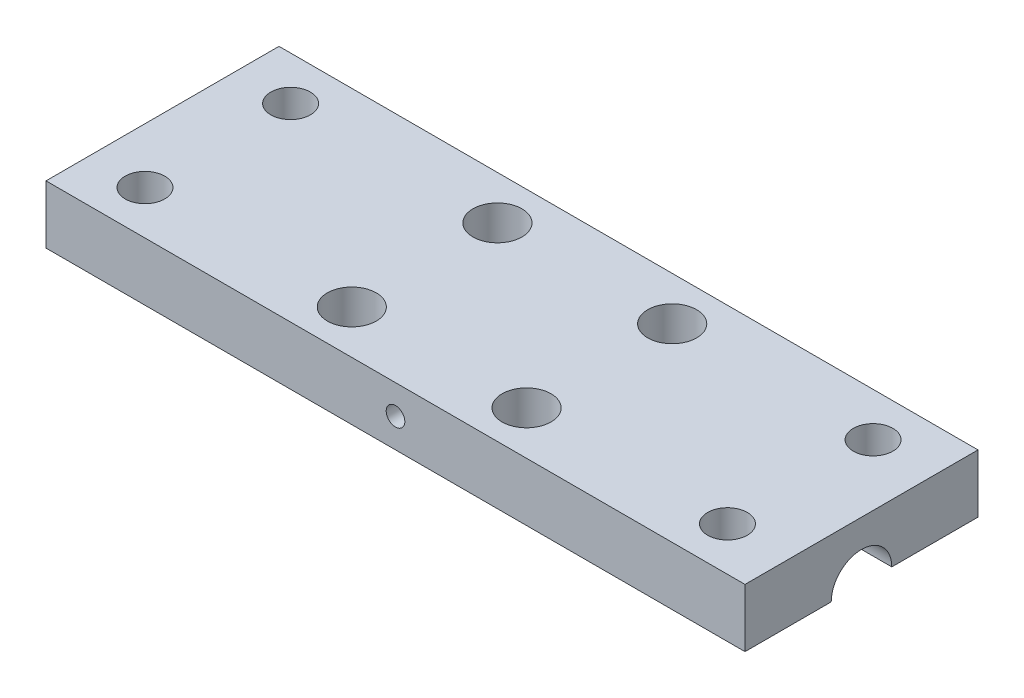
ISO-10303-21;
HEADER;
FILE_DESCRIPTION(('STEP AP214'),'2;1');
FILE_NAME('part.step','',(''),(''),'','','');
FILE_SCHEMA(('AUTOMOTIVE_DESIGN { 1 0 10303 214 1 1 1 1 }'));
ENDSEC;
DATA;
#1=APPLICATION_CONTEXT('core data for automotive mechanical design processes');
#2=APPLICATION_PROTOCOL_DEFINITION('international standard','automotive_design',2000,#1);
#3=PRODUCT_CONTEXT('',#1,'mechanical');
#4=PRODUCT('Part','Part','',(#3));
#5=PRODUCT_RELATED_PRODUCT_CATEGORY('part','',(#4));
#6=PRODUCT_DEFINITION_FORMATION('','',#4);
#7=PRODUCT_DEFINITION_CONTEXT('part definition',#1,'design');
#8=PRODUCT_DEFINITION('design','',#6,#7);
#9=PRODUCT_DEFINITION_SHAPE('','',#8);
#10=(LENGTH_UNIT() NAMED_UNIT(*) SI_UNIT(.MILLI.,.METRE.));
#11=(NAMED_UNIT(*) PLANE_ANGLE_UNIT() SI_UNIT($,.RADIAN.));
#12=(NAMED_UNIT(*) SI_UNIT($,.STERADIAN.) SOLID_ANGLE_UNIT());
#13=UNCERTAINTY_MEASURE_WITH_UNIT(LENGTH_MEASURE(1.E-05),#10,'distance_accuracy_value','');
#14=(GEOMETRIC_REPRESENTATION_CONTEXT(3) GLOBAL_UNCERTAINTY_ASSIGNED_CONTEXT((#13)) GLOBAL_UNIT_ASSIGNED_CONTEXT((#10,
#11,#12)) REPRESENTATION_CONTEXT('',''));
#15=CARTESIAN_POINT('',(0.,0.,0.));
#16=DIRECTION('',(0.,0.,1.));
#17=DIRECTION('',(1.,0.,0.));
#18=AXIS2_PLACEMENT_3D('',#15,#16,#17);
#19=CARTESIAN_POINT('',(0.,0.,0.));
#20=DIRECTION('',(0.,1.,0.));
#21=DIRECTION('',(0.,0.,1.));
#22=AXIS2_PLACEMENT_3D('',#19,#20,#21);
#23=PLANE('',#22);
#24=CARTESIAN_POINT('',(-32.0740758823868,0.,7.9375));
#25=DIRECTION('',(0.,1.,0.));
#26=DIRECTION('',(0.,0.,1.));
#27=AXIS2_PLACEMENT_3D('',#24,#25,#26);
#28=CIRCLE('',#27,2.159);
#29=CARTESIAN_POINT('',(-32.0740758823868,0.,10.0965));
#30=VERTEX_POINT('',#29);
#31=EDGE_CURVE('E176',#30,#30,#28,.T.);
#32=ORIENTED_EDGE('',*,*,#31,.T.);
#33=EDGE_LOOP('',(#32));
#34=FACE_BOUND('',#33,.T.);
#35=CARTESIAN_POINT('',(31.4259241176133,0.,7.9375));
#36=DIRECTION('',(0.,1.,0.));
#37=DIRECTION('',(0.,0.,1.));
#38=AXIS2_PLACEMENT_3D('',#35,#36,#37);
#39=CIRCLE('',#38,2.159);
#40=CARTESIAN_POINT('',(31.4259241176133,0.,10.0965));
#41=VERTEX_POINT('',#40);
#42=EDGE_CURVE('E233',#41,#41,#39,.T.);
#43=ORIENTED_EDGE('',*,*,#42,.T.);
#44=EDGE_LOOP('',(#43));
#45=FACE_BOUND('',#44,.T.);
#46=CARTESIAN_POINT('',(-9.525,0.,7.9375));
#47=DIRECTION('',(0.,1.,0.));
#48=DIRECTION('',(0.,0.,1.));
#49=AXIS2_PLACEMENT_3D('',#46,#47,#48);
#50=CIRCLE('',#49,2.667);
#51=CARTESIAN_POINT('',(-9.525,0.,10.6045));
#52=VERTEX_POINT('',#51);
#53=EDGE_CURVE('E223',#52,#52,#50,.T.);
#54=ORIENTED_EDGE('',*,*,#53,.T.);
#55=EDGE_LOOP('',(#54));
#56=FACE_BOUND('',#55,.T.);
#57=CARTESIAN_POINT('',(9.525,0.,7.9375));
#58=DIRECTION('',(0.,1.,0.));
#59=DIRECTION('',(0.,0.,1.));
#60=AXIS2_PLACEMENT_3D('',#57,#58,#59);
#61=CIRCLE('',#60,2.667);
#62=CARTESIAN_POINT('',(9.525,0.,10.6045));
#63=VERTEX_POINT('',#62);
#64=EDGE_CURVE('E213',#63,#63,#61,.T.);
#65=ORIENTED_EDGE('',*,*,#64,.T.);
#66=EDGE_LOOP('',(#65));
#67=FACE_BOUND('',#66,.T.);
#68=DIRECTION('',(0.,0.,1.));
#69=VECTOR('',#68,1.);
#70=CARTESIAN_POINT('',(-38.1,0.,-12.7));
#71=LINE('',#70,#69);
#72=CARTESIAN_POINT('',(-38.1,0.,3.30199999999999));
#73=VERTEX_POINT('',#72);
#74=CARTESIAN_POINT('',(-38.1,0.,12.7));
#75=VERTEX_POINT('',#74);
#76=EDGE_CURVE('E133',#73,#75,#71,.T.);
#77=ORIENTED_EDGE('',*,*,#76,.F.);
#78=DIRECTION('',(1.,0.,0.));
#79=VECTOR('',#78,1.);
#80=CARTESIAN_POINT('',(-38.1,0.,3.30199999999999));
#81=LINE('',#80,#79);
#82=CARTESIAN_POINT('',(38.1,0.,3.30200000000001));
#83=VERTEX_POINT('',#82);
#84=EDGE_CURVE('E11',#73,#83,#81,.T.);
#85=ORIENTED_EDGE('',*,*,#84,.T.);
#86=DIRECTION('',(0.,0.,-1.));
#87=VECTOR('',#86,1.);
#88=CARTESIAN_POINT('',(38.1,0.,-12.7));
#89=LINE('',#88,#87);
#90=CARTESIAN_POINT('',(38.1,0.,12.7));
#91=VERTEX_POINT('',#90);
#92=EDGE_CURVE('E110',#91,#83,#89,.T.);
#93=ORIENTED_EDGE('',*,*,#92,.F.);
#94=DIRECTION('',(1.,0.,0.));
#95=VECTOR('',#94,1.);
#96=CARTESIAN_POINT('',(-38.1,0.,12.7));
#97=LINE('',#96,#95);
#98=EDGE_CURVE('E113',#75,#91,#97,.T.);
#99=ORIENTED_EDGE('',*,*,#98,.F.);
#100=EDGE_LOOP('',(#77,#85,#93,#99));
#101=FACE_BOUND('',#100,.T.);
#102=ADVANCED_FACE('F35',(#34,#45,#56,#67,#101),#23,.F.);
#103=CARTESIAN_POINT('',(-38.1,6.35,-12.7));
#104=DIRECTION('',(1.,0.,0.));
#105=DIRECTION('',(0.,0.,-1.));
#106=AXIS2_PLACEMENT_3D('',#103,#104,#105);
#107=PLANE('',#106);
#108=CARTESIAN_POINT('',(-38.1,0.,-12.7));
#109=VERTEX_POINT('',#108);
#110=CARTESIAN_POINT('',(-38.1,0.,-3.30200000000001));
#111=VERTEX_POINT('',#110);
#112=EDGE_CURVE('E115',#109,#111,#71,.T.);
#113=ORIENTED_EDGE('',*,*,#112,.T.);
#114=CARTESIAN_POINT('',(-38.1,0.,0.));
#115=DIRECTION('',(1.,0.,0.));
#116=DIRECTION('',(0.,0.,-1.));
#117=AXIS2_PLACEMENT_3D('',#114,#115,#116);
#118=CIRCLE('',#117,3.302);
#119=EDGE_CURVE('E50',#111,#73,#118,.T.);
#120=ORIENTED_EDGE('',*,*,#119,.T.);
#121=ORIENTED_EDGE('',*,*,#76,.T.);
#122=DIRECTION('',(0.,-1.,0.));
#123=VECTOR('',#122,1.);
#124=CARTESIAN_POINT('',(-38.1,6.35,12.7));
#125=LINE('',#124,#123);
#126=CARTESIAN_POINT('',(-38.1,6.35,12.7));
#127=VERTEX_POINT('',#126);
#128=EDGE_CURVE('E102',#127,#75,#125,.T.);
#129=ORIENTED_EDGE('',*,*,#128,.F.);
#130=DIRECTION('',(0.,0.,1.));
#131=VECTOR('',#130,1.);
#132=CARTESIAN_POINT('',(-38.1,6.35,-12.7));
#133=LINE('',#132,#131);
#134=CARTESIAN_POINT('',(-38.1,6.35,-12.7));
#135=VERTEX_POINT('',#134);
#136=EDGE_CURVE('E120',#135,#127,#133,.T.);
#137=ORIENTED_EDGE('',*,*,#136,.F.);
#138=DIRECTION('',(0.,-1.,0.));
#139=VECTOR('',#138,1.);
#140=CARTESIAN_POINT('',(-38.1,6.35,-12.7));
#141=LINE('',#140,#139);
#142=EDGE_CURVE('E121',#135,#109,#141,.T.);
#143=ORIENTED_EDGE('',*,*,#142,.T.);
#144=EDGE_LOOP('',(#113,#120,#121,#129,#137,#143));
#145=FACE_BOUND('',#144,.T.);
#146=ADVANCED_FACE('F37',(#145),#107,.F.);
#147=CARTESIAN_POINT('',(-38.1,6.35,12.7));
#148=DIRECTION('',(0.,0.,-1.));
#149=DIRECTION('',(-1.,0.,0.));
#150=AXIS2_PLACEMENT_3D('',#147,#148,#149);
#151=PLANE('',#150);
#152=CARTESIAN_POINT('',(0.,3.175,12.7));
#153=DIRECTION('',(0.,0.,1.));
#154=DIRECTION('',(1.,0.,0.));
#155=AXIS2_PLACEMENT_3D('',#152,#153,#154);
#156=CIRCLE('',#155,1.016);
#157=CARTESIAN_POINT('',(1.016,3.175,12.7));
#158=VERTEX_POINT('',#157);
#159=EDGE_CURVE('E200',#158,#158,#156,.T.);
#160=ORIENTED_EDGE('',*,*,#159,.F.);
#161=EDGE_LOOP('',(#160));
#162=FACE_BOUND('',#161,.T.);
#163=ORIENTED_EDGE('',*,*,#98,.T.);
#164=DIRECTION('',(0.,-1.,0.));
#165=VECTOR('',#164,1.);
#166=CARTESIAN_POINT('',(38.1,6.35,12.7));
#167=LINE('',#166,#165);
#168=CARTESIAN_POINT('',(38.1,6.35,12.7));
#169=VERTEX_POINT('',#168);
#170=EDGE_CURVE('E125',#169,#91,#167,.T.);
#171=ORIENTED_EDGE('',*,*,#170,.F.);
#172=DIRECTION('',(1.,0.,0.));
#173=VECTOR('',#172,1.);
#174=CARTESIAN_POINT('',(-38.1,6.35,12.7));
#175=LINE('',#174,#173);
#176=EDGE_CURVE('E88',#127,#169,#175,.T.);
#177=ORIENTED_EDGE('',*,*,#176,.F.);
#178=ORIENTED_EDGE('',*,*,#128,.T.);
#179=EDGE_LOOP('',(#163,#171,#177,#178));
#180=FACE_BOUND('',#179,.T.);
#181=ADVANCED_FACE('F128',(#162,#180),#151,.F.);
#182=CARTESIAN_POINT('',(38.1,6.35,-12.7));
#183=DIRECTION('',(-1.,0.,0.));
#184=DIRECTION('',(0.,0.,1.));
#185=AXIS2_PLACEMENT_3D('',#182,#183,#184);
#186=PLANE('',#185);
#187=ORIENTED_EDGE('',*,*,#92,.T.);
#188=CARTESIAN_POINT('',(38.1,0.,0.));
#189=DIRECTION('',(1.,0.,0.));
#190=DIRECTION('',(0.,0.,-1.));
#191=AXIS2_PLACEMENT_3D('',#188,#189,#190);
#192=CIRCLE('',#191,3.302);
#193=CARTESIAN_POINT('',(38.1,0.,-3.30199999999999));
#194=VERTEX_POINT('',#193);
#195=EDGE_CURVE('E97',#194,#83,#192,.T.);
#196=ORIENTED_EDGE('',*,*,#195,.F.);
#197=CARTESIAN_POINT('',(38.1,0.,-12.7));
#198=VERTEX_POINT('',#197);
#199=EDGE_CURVE('E107',#194,#198,#89,.T.);
#200=ORIENTED_EDGE('',*,*,#199,.T.);
#201=DIRECTION('',(0.,-1.,0.));
#202=VECTOR('',#201,1.);
#203=CARTESIAN_POINT('',(38.1,6.35,-12.7));
#204=LINE('',#203,#202);
#205=CARTESIAN_POINT('',(38.1,6.35,-12.7));
#206=VERTEX_POINT('',#205);
#207=EDGE_CURVE('E123',#206,#198,#204,.T.);
#208=ORIENTED_EDGE('',*,*,#207,.F.);
#209=DIRECTION('',(0.,0.,-1.));
#210=VECTOR('',#209,1.);
#211=CARTESIAN_POINT('',(38.1,6.35,-12.7));
#212=LINE('',#211,#210);
#213=EDGE_CURVE('E184',#169,#206,#212,.T.);
#214=ORIENTED_EDGE('',*,*,#213,.F.);
#215=ORIENTED_EDGE('',*,*,#170,.T.);
#216=EDGE_LOOP('',(#187,#196,#200,#208,#214,#215));
#217=FACE_BOUND('',#216,.T.);
#218=ADVANCED_FACE('F105',(#217),#186,.F.);
#219=CARTESIAN_POINT('',(-38.1,6.35,-12.7));
#220=DIRECTION('',(0.,0.,1.));
#221=DIRECTION('',(1.,0.,0.));
#222=AXIS2_PLACEMENT_3D('',#219,#220,#221);
#223=PLANE('',#222);
#224=CARTESIAN_POINT('',(0.,3.175,-12.7));
#225=DIRECTION('',(0.,0.,-1.));
#226=DIRECTION('',(-1.,0.,0.));
#227=AXIS2_PLACEMENT_3D('',#224,#225,#226);
#228=CIRCLE('',#227,1.016);
#229=CARTESIAN_POINT('',(-1.016,3.175,-12.7));
#230=VERTEX_POINT('',#229);
#231=EDGE_CURVE('E209',#230,#230,#228,.T.);
#232=ORIENTED_EDGE('',*,*,#231,.F.);
#233=EDGE_LOOP('',(#232));
#234=FACE_BOUND('',#233,.T.);
#235=DIRECTION('',(-1.,0.,0.));
#236=VECTOR('',#235,1.);
#237=CARTESIAN_POINT('',(-38.1,0.,-12.7));
#238=LINE('',#237,#236);
#239=EDGE_CURVE('E80',#198,#109,#238,.T.);
#240=ORIENTED_EDGE('',*,*,#239,.T.);
#241=ORIENTED_EDGE('',*,*,#142,.F.);
#242=DIRECTION('',(-1.,0.,0.));
#243=VECTOR('',#242,1.);
#244=CARTESIAN_POINT('',(-38.1,6.35,-12.7));
#245=LINE('',#244,#243);
#246=EDGE_CURVE('E59',#206,#135,#245,.T.);
#247=ORIENTED_EDGE('',*,*,#246,.F.);
#248=ORIENTED_EDGE('',*,*,#207,.T.);
#249=EDGE_LOOP('',(#240,#241,#247,#248));
#250=FACE_BOUND('',#249,.T.);
#251=ADVANCED_FACE('F157',(#234,#250),#223,.F.);
#252=CARTESIAN_POINT('',(0.,6.35,0.));
#253=DIRECTION('',(0.,1.,0.));
#254=DIRECTION('',(0.,0.,1.));
#255=AXIS2_PLACEMENT_3D('',#252,#253,#254);
#256=PLANE('',#255);
#257=CARTESIAN_POINT('',(9.525,6.35,7.9375));
#258=DIRECTION('',(0.,1.,0.));
#259=DIRECTION('',(0.,0.,1.));
#260=AXIS2_PLACEMENT_3D('',#257,#258,#259);
#261=CIRCLE('',#260,2.667);
#262=CARTESIAN_POINT('',(9.525,6.35,10.6045));
#263=VERTEX_POINT('',#262);
#264=EDGE_CURVE('E206',#263,#263,#261,.T.);
#265=ORIENTED_EDGE('',*,*,#264,.F.);
#266=EDGE_LOOP('',(#265));
#267=FACE_BOUND('',#266,.T.);
#268=CARTESIAN_POINT('',(9.525,6.35,-7.9375));
#269=DIRECTION('',(0.,1.,0.));
#270=DIRECTION('',(0.,0.,1.));
#271=AXIS2_PLACEMENT_3D('',#268,#269,#270);
#272=CIRCLE('',#271,2.667);
#273=CARTESIAN_POINT('',(9.525,6.35,-5.2705));
#274=VERTEX_POINT('',#273);
#275=EDGE_CURVE('E216',#274,#274,#272,.T.);
#276=ORIENTED_EDGE('',*,*,#275,.F.);
#277=EDGE_LOOP('',(#276));
#278=FACE_BOUND('',#277,.T.);
#279=CARTESIAN_POINT('',(-9.525,6.35,7.9375));
#280=DIRECTION('',(0.,1.,0.));
#281=DIRECTION('',(0.,0.,1.));
#282=AXIS2_PLACEMENT_3D('',#279,#280,#281);
#283=CIRCLE('',#282,2.667);
#284=CARTESIAN_POINT('',(-9.525,6.35,10.6045));
#285=VERTEX_POINT('',#284);
#286=EDGE_CURVE('E220',#285,#285,#283,.T.);
#287=ORIENTED_EDGE('',*,*,#286,.F.);
#288=EDGE_LOOP('',(#287));
#289=FACE_BOUND('',#288,.T.);
#290=CARTESIAN_POINT('',(-9.525,6.35,-7.9375));
#291=DIRECTION('',(0.,1.,0.));
#292=DIRECTION('',(0.,0.,1.));
#293=AXIS2_PLACEMENT_3D('',#290,#291,#292);
#294=CIRCLE('',#293,2.667);
#295=CARTESIAN_POINT('',(-9.525,6.35,-5.2705));
#296=VERTEX_POINT('',#295);
#297=EDGE_CURVE('E226',#296,#296,#294,.T.);
#298=ORIENTED_EDGE('',*,*,#297,.F.);
#299=EDGE_LOOP('',(#298));
#300=FACE_BOUND('',#299,.T.);
#301=CARTESIAN_POINT('',(31.4259241176133,6.35,7.9375));
#302=DIRECTION('',(0.,1.,0.));
#303=DIRECTION('',(0.,0.,1.));
#304=AXIS2_PLACEMENT_3D('',#301,#302,#303);
#305=CIRCLE('',#304,2.159);
#306=CARTESIAN_POINT('',(31.4259241176133,6.35,10.0965));
#307=VERTEX_POINT('',#306);
#308=EDGE_CURVE('E230',#307,#307,#305,.T.);
#309=ORIENTED_EDGE('',*,*,#308,.F.);
#310=EDGE_LOOP('',(#309));
#311=FACE_BOUND('',#310,.T.);
#312=CARTESIAN_POINT('',(31.4259241176133,6.35,-7.9375));
#313=DIRECTION('',(0.,1.,0.));
#314=DIRECTION('',(0.,0.,1.));
#315=AXIS2_PLACEMENT_3D('',#312,#313,#314);
#316=CIRCLE('',#315,2.159);
#317=CARTESIAN_POINT('',(31.4259241176133,6.35,-5.7785));
#318=VERTEX_POINT('',#317);
#319=EDGE_CURVE('E236',#318,#318,#316,.T.);
#320=ORIENTED_EDGE('',*,*,#319,.F.);
#321=EDGE_LOOP('',(#320));
#322=FACE_BOUND('',#321,.T.);
#323=CARTESIAN_POINT('',(-32.0740758823868,6.35,7.9375));
#324=DIRECTION('',(0.,1.,0.));
#325=DIRECTION('',(0.,0.,1.));
#326=AXIS2_PLACEMENT_3D('',#323,#324,#325);
#327=CIRCLE('',#326,2.159);
#328=CARTESIAN_POINT('',(-32.0740758823868,6.35,10.0965));
#329=VERTEX_POINT('',#328);
#330=EDGE_CURVE('E179',#329,#329,#327,.T.);
#331=ORIENTED_EDGE('',*,*,#330,.F.);
#332=EDGE_LOOP('',(#331));
#333=FACE_BOUND('',#332,.T.);
#334=CARTESIAN_POINT('',(-32.0740758823868,6.35,-7.9375));
#335=DIRECTION('',(0.,1.,0.));
#336=DIRECTION('',(0.,0.,1.));
#337=AXIS2_PLACEMENT_3D('',#334,#335,#336);
#338=CIRCLE('',#337,2.159);
#339=CARTESIAN_POINT('',(-32.0740758823868,6.35,-5.7785));
#340=VERTEX_POINT('',#339);
#341=EDGE_CURVE('E173',#340,#340,#338,.T.);
#342=ORIENTED_EDGE('',*,*,#341,.F.);
#343=EDGE_LOOP('',(#342));
#344=FACE_BOUND('',#343,.T.);
#345=ORIENTED_EDGE('',*,*,#136,.T.);
#346=ORIENTED_EDGE('',*,*,#176,.T.);
#347=ORIENTED_EDGE('',*,*,#213,.T.);
#348=ORIENTED_EDGE('',*,*,#246,.T.);
#349=EDGE_LOOP('',(#345,#346,#347,#348));
#350=FACE_BOUND('',#349,.T.);
#351=ADVANCED_FACE('F148',(#267,#278,#289,#300,#311,#322,#333,#344,#350),#256,.T.);
#352=CARTESIAN_POINT('',(9.525,0.,-7.9375));
#353=DIRECTION('',(0.,1.,0.));
#354=DIRECTION('',(0.,0.,1.));
#355=AXIS2_PLACEMENT_3D('',#352,#353,#354);
#356=CIRCLE('',#355,2.667);
#357=CARTESIAN_POINT('',(9.525,0.,-5.2705));
#358=VERTEX_POINT('',#357);
#359=EDGE_CURVE('E162',#358,#358,#356,.T.);
#360=ORIENTED_EDGE('',*,*,#359,.T.);
#361=EDGE_LOOP('',(#360));
#362=FACE_BOUND('',#361,.T.);
#363=CARTESIAN_POINT('',(-9.525,0.,-7.9375));
#364=DIRECTION('',(0.,1.,0.));
#365=DIRECTION('',(0.,0.,1.));
#366=AXIS2_PLACEMENT_3D('',#363,#364,#365);
#367=CIRCLE('',#366,2.667);
#368=CARTESIAN_POINT('',(-9.525,0.,-5.2705));
#369=VERTEX_POINT('',#368);
#370=EDGE_CURVE('E166',#369,#369,#367,.T.);
#371=ORIENTED_EDGE('',*,*,#370,.T.);
#372=EDGE_LOOP('',(#371));
#373=FACE_BOUND('',#372,.T.);
#374=CARTESIAN_POINT('',(31.4259241176133,0.,-7.9375));
#375=DIRECTION('',(0.,1.,0.));
#376=DIRECTION('',(0.,0.,1.));
#377=AXIS2_PLACEMENT_3D('',#374,#375,#376);
#378=CIRCLE('',#377,2.159);
#379=CARTESIAN_POINT('',(31.4259241176133,0.,-5.7785));
#380=VERTEX_POINT('',#379);
#381=EDGE_CURVE('E170',#380,#380,#378,.T.);
#382=ORIENTED_EDGE('',*,*,#381,.T.);
#383=EDGE_LOOP('',(#382));
#384=FACE_BOUND('',#383,.T.);
#385=CARTESIAN_POINT('',(-32.0740758823868,0.,-7.9375));
#386=DIRECTION('',(0.,1.,0.));
#387=DIRECTION('',(0.,0.,1.));
#388=AXIS2_PLACEMENT_3D('',#385,#386,#387);
#389=CIRCLE('',#388,2.159);
#390=CARTESIAN_POINT('',(-32.0740758823868,0.,-5.7785));
#391=VERTEX_POINT('',#390);
#392=EDGE_CURVE('E135',#391,#391,#389,.T.);
#393=ORIENTED_EDGE('',*,*,#392,.T.);
#394=EDGE_LOOP('',(#393));
#395=FACE_BOUND('',#394,.T.);
#396=ORIENTED_EDGE('',*,*,#199,.F.);
#397=DIRECTION('',(1.,0.,0.));
#398=VECTOR('',#397,1.);
#399=CARTESIAN_POINT('',(-38.1,0.,-3.30200000000001));
#400=LINE('',#399,#398);
#401=EDGE_CURVE('E43',#194,#111,#400,.F.);
#402=ORIENTED_EDGE('',*,*,#401,.T.);
#403=ORIENTED_EDGE('',*,*,#112,.F.);
#404=ORIENTED_EDGE('',*,*,#239,.F.);
#405=EDGE_LOOP('',(#396,#402,#403,#404));
#406=FACE_BOUND('',#405,.T.);
#407=ADVANCED_FACE('F112',(#362,#373,#384,#395,#406),#23,.F.);
#408=CARTESIAN_POINT('',(-32.0740758823868,0.,-7.9375));
#409=DIRECTION('',(0.,1.,0.));
#410=DIRECTION('',(0.,0.,1.));
#411=AXIS2_PLACEMENT_3D('',#408,#409,#410);
#412=CYLINDRICAL_SURFACE('',#411,2.159);
#413=ORIENTED_EDGE('',*,*,#392,.F.);
#414=EDGE_LOOP('',(#413));
#415=FACE_BOUND('',#414,.T.);
#416=ORIENTED_EDGE('',*,*,#341,.T.);
#417=EDGE_LOOP('',(#416));
#418=FACE_BOUND('',#417,.T.);
#419=ADVANCED_FACE('F147',(#415,#418),#412,.F.);
#420=CARTESIAN_POINT('',(-32.0740758823868,0.,7.9375));
#421=DIRECTION('',(0.,1.,0.));
#422=DIRECTION('',(0.,0.,1.));
#423=AXIS2_PLACEMENT_3D('',#420,#421,#422);
#424=CYLINDRICAL_SURFACE('',#423,2.159);
#425=ORIENTED_EDGE('',*,*,#31,.F.);
#426=EDGE_LOOP('',(#425));
#427=FACE_BOUND('',#426,.T.);
#428=ORIENTED_EDGE('',*,*,#330,.T.);
#429=EDGE_LOOP('',(#428));
#430=FACE_BOUND('',#429,.T.);
#431=ADVANCED_FACE('F154',(#427,#430),#424,.F.);
#432=CARTESIAN_POINT('',(31.4259241176133,0.,-7.9375));
#433=DIRECTION('',(0.,1.,0.));
#434=DIRECTION('',(0.,0.,1.));
#435=AXIS2_PLACEMENT_3D('',#432,#433,#434);
#436=CYLINDRICAL_SURFACE('',#435,2.159);
#437=ORIENTED_EDGE('',*,*,#381,.F.);
#438=EDGE_LOOP('',(#437));
#439=FACE_BOUND('',#438,.T.);
#440=ORIENTED_EDGE('',*,*,#319,.T.);
#441=EDGE_LOOP('',(#440));
#442=FACE_BOUND('',#441,.T.);
#443=ADVANCED_FACE('F250',(#439,#442),#436,.F.);
#444=CARTESIAN_POINT('',(31.4259241176133,0.,7.9375));
#445=DIRECTION('',(0.,1.,0.));
#446=DIRECTION('',(0.,0.,1.));
#447=AXIS2_PLACEMENT_3D('',#444,#445,#446);
#448=CYLINDRICAL_SURFACE('',#447,2.159);
#449=ORIENTED_EDGE('',*,*,#42,.F.);
#450=EDGE_LOOP('',(#449));
#451=FACE_BOUND('',#450,.T.);
#452=ORIENTED_EDGE('',*,*,#308,.T.);
#453=EDGE_LOOP('',(#452));
#454=FACE_BOUND('',#453,.T.);
#455=ADVANCED_FACE('F256',(#451,#454),#448,.F.);
#456=CARTESIAN_POINT('',(-9.525,0.,-7.9375));
#457=DIRECTION('',(0.,1.,0.));
#458=DIRECTION('',(0.,0.,1.));
#459=AXIS2_PLACEMENT_3D('',#456,#457,#458);
#460=CYLINDRICAL_SURFACE('',#459,2.667);
#461=ORIENTED_EDGE('',*,*,#370,.F.);
#462=EDGE_LOOP('',(#461));
#463=FACE_BOUND('',#462,.T.);
#464=ORIENTED_EDGE('',*,*,#297,.T.);
#465=EDGE_LOOP('',(#464));
#466=FACE_BOUND('',#465,.T.);
#467=ADVANCED_FACE('F262',(#463,#466),#460,.F.);
#468=CARTESIAN_POINT('',(-9.525,0.,7.9375));
#469=DIRECTION('',(0.,1.,0.));
#470=DIRECTION('',(0.,0.,1.));
#471=AXIS2_PLACEMENT_3D('',#468,#469,#470);
#472=CYLINDRICAL_SURFACE('',#471,2.667);
#473=ORIENTED_EDGE('',*,*,#53,.F.);
#474=EDGE_LOOP('',(#473));
#475=FACE_BOUND('',#474,.T.);
#476=ORIENTED_EDGE('',*,*,#286,.T.);
#477=EDGE_LOOP('',(#476));
#478=FACE_BOUND('',#477,.T.);
#479=ADVANCED_FACE('F266',(#475,#478),#472,.F.);
#480=CARTESIAN_POINT('',(9.525,0.,-7.9375));
#481=DIRECTION('',(0.,1.,0.));
#482=DIRECTION('',(0.,0.,1.));
#483=AXIS2_PLACEMENT_3D('',#480,#481,#482);
#484=CYLINDRICAL_SURFACE('',#483,2.667);
#485=ORIENTED_EDGE('',*,*,#359,.F.);
#486=EDGE_LOOP('',(#485));
#487=FACE_BOUND('',#486,.T.);
#488=ORIENTED_EDGE('',*,*,#275,.T.);
#489=EDGE_LOOP('',(#488));
#490=FACE_BOUND('',#489,.T.);
#491=ADVANCED_FACE('F270',(#487,#490),#484,.F.);
#492=CARTESIAN_POINT('',(9.525,0.,7.9375));
#493=DIRECTION('',(0.,1.,0.));
#494=DIRECTION('',(0.,0.,1.));
#495=AXIS2_PLACEMENT_3D('',#492,#493,#494);
#496=CYLINDRICAL_SURFACE('',#495,2.667);
#497=ORIENTED_EDGE('',*,*,#64,.F.);
#498=EDGE_LOOP('',(#497));
#499=FACE_BOUND('',#498,.T.);
#500=ORIENTED_EDGE('',*,*,#264,.T.);
#501=EDGE_LOOP('',(#500));
#502=FACE_BOUND('',#501,.T.);
#503=ADVANCED_FACE('F274',(#499,#502),#496,.F.);
#504=CARTESIAN_POINT('',(0.,3.175,5.08));
#505=DIRECTION('',(0.,0.,1.));
#506=DIRECTION('',(1.,0.,0.));
#507=AXIS2_PLACEMENT_3D('',#504,#505,#506);
#508=CYLINDRICAL_SURFACE('',#507,1.016);
#509=CARTESIAN_POINT('',(0.,3.175,5.08));
#510=DIRECTION('',(0.,0.,1.));
#511=DIRECTION('',(1.,0.,0.));
#512=AXIS2_PLACEMENT_3D('',#509,#510,#511);
#513=CIRCLE('',#512,1.016);
#514=CARTESIAN_POINT('',(1.016,3.175,5.08));
#515=VERTEX_POINT('',#514);
#516=EDGE_CURVE('E202',#515,#515,#513,.T.);
#517=CARTESIAN_POINT('',(1.016,3.175,5.08));
#518=CARTESIAN_POINT('',(1.016,3.175,5.159375));
#519=CARTESIAN_POINT('',(1.016,3.175,5.23875));
#520=CARTESIAN_POINT('',(1.016,3.175,5.3975));
#521=CARTESIAN_POINT('',(1.016,3.175,5.476875));
#522=CARTESIAN_POINT('',(1.016,3.175,5.635625));
#523=CARTESIAN_POINT('',(1.016,3.175,5.715));
#524=CARTESIAN_POINT('',(1.016,3.175,5.87375));
#525=CARTESIAN_POINT('',(1.016,3.175,5.953125));
#526=CARTESIAN_POINT('',(1.016,3.175,6.111875));
#527=CARTESIAN_POINT('',(1.016,3.175,6.19125));
#528=CARTESIAN_POINT('',(1.016,3.175,6.35));
#529=CARTESIAN_POINT('',(1.016,3.175,6.429375));
#530=CARTESIAN_POINT('',(1.016,3.175,6.588125));
#531=CARTESIAN_POINT('',(1.016,3.175,6.6675));
#532=CARTESIAN_POINT('',(1.016,3.175,6.82625));
#533=CARTESIAN_POINT('',(1.016,3.175,6.905625));
#534=CARTESIAN_POINT('',(1.016,3.175,7.064375));
#535=CARTESIAN_POINT('',(1.016,3.175,7.14375));
#536=CARTESIAN_POINT('',(1.016,3.175,7.3025));
#537=CARTESIAN_POINT('',(1.016,3.175,7.381875));
#538=CARTESIAN_POINT('',(1.016,3.175,7.540625));
#539=CARTESIAN_POINT('',(1.016,3.175,7.62));
#540=CARTESIAN_POINT('',(1.016,3.175,7.77875));
#541=CARTESIAN_POINT('',(1.016,3.175,7.858125));
#542=CARTESIAN_POINT('',(1.016,3.175,8.016875));
#543=CARTESIAN_POINT('',(1.016,3.175,8.09625));
#544=CARTESIAN_POINT('',(1.016,3.175,8.255));
#545=CARTESIAN_POINT('',(1.016,3.175,8.334375));
#546=CARTESIAN_POINT('',(1.016,3.175,8.493125));
#547=CARTESIAN_POINT('',(1.016,3.175,8.5725));
#548=CARTESIAN_POINT('',(1.016,3.175,8.73125));
#549=CARTESIAN_POINT('',(1.016,3.175,8.810625));
#550=CARTESIAN_POINT('',(1.016,3.175,8.969375));
#551=CARTESIAN_POINT('',(1.016,3.175,9.04875));
#552=CARTESIAN_POINT('',(1.016,3.175,9.2075));
#553=CARTESIAN_POINT('',(1.016,3.175,9.286875));
#554=CARTESIAN_POINT('',(1.016,3.175,9.445625));
#555=CARTESIAN_POINT('',(1.016,3.175,9.525));
#556=CARTESIAN_POINT('',(1.016,3.175,9.68375));
#557=CARTESIAN_POINT('',(1.016,3.175,9.763125));
#558=CARTESIAN_POINT('',(1.016,3.175,9.921875));
#559=CARTESIAN_POINT('',(1.016,3.175,10.00125));
#560=CARTESIAN_POINT('',(1.016,3.175,10.16));
#561=CARTESIAN_POINT('',(1.016,3.175,10.239375));
#562=CARTESIAN_POINT('',(1.016,3.175,10.398125));
#563=CARTESIAN_POINT('',(1.016,3.175,10.4775));
#564=CARTESIAN_POINT('',(1.016,3.175,10.63625));
#565=CARTESIAN_POINT('',(1.016,3.175,10.715625));
#566=CARTESIAN_POINT('',(1.016,3.175,10.874375));
#567=CARTESIAN_POINT('',(1.016,3.175,10.95375));
#568=CARTESIAN_POINT('',(1.016,3.175,11.1125));
#569=CARTESIAN_POINT('',(1.016,3.175,11.191875));
#570=CARTESIAN_POINT('',(1.016,3.175,11.350625));
#571=CARTESIAN_POINT('',(1.016,3.175,11.43));
#572=CARTESIAN_POINT('',(1.016,3.175,11.58875));
#573=CARTESIAN_POINT('',(1.016,3.175,11.668125));
#574=CARTESIAN_POINT('',(1.016,3.175,11.826875));
#575=CARTESIAN_POINT('',(1.016,3.175,11.90625));
#576=CARTESIAN_POINT('',(1.016,3.175,12.065));
#577=CARTESIAN_POINT('',(1.016,3.175,12.144375));
#578=CARTESIAN_POINT('',(1.016,3.175,12.303125));
#579=CARTESIAN_POINT('',(1.016,3.175,12.3825));
#580=CARTESIAN_POINT('',(1.016,3.175,12.54125));
#581=CARTESIAN_POINT('',(1.016,3.175,12.620625));
#582=CARTESIAN_POINT('',(1.016,3.175,12.7));
#583=B_SPLINE_CURVE_WITH_KNOTS('',3,(#517,#518,#519,#520,#521,#522,#523,#524,#525,#526,#527,
#528,#529,#530,#531,#532,#533,#534,#535,#536,#537,#538,#539,#540,#541,#542,#543,#544,#545,#546,
#547,#548,#549,#550,#551,#552,#553,#554,#555,#556,#557,#558,#559,#560,#561,#562,#563,#564,#565,
#566,#567,#568,#569,#570,#571,#572,#573,#574,#575,#576,#577,#578,#579,#580,#581,#582),
.UNSPECIFIED.,.F.,.F.,(4,2,2,2,2,2,2,2,2,2,2,2,2,2,2,2,2,2,2,2,2,2,2,2,2,2,2,2,2,2,2,2,4),(0.,
0.238125,0.476249999999999,0.714374999999999,0.952499999999999,1.190625,1.42875,1.666875,1.905,
2.143125,2.38125,2.619375,2.8575,3.095625,3.33375,3.571875,3.81,4.048125,4.28625,4.524375,
4.7625,5.000625,5.23875,5.476875,5.715,5.953125,6.19125,6.429375,6.6675,6.905625,7.14375,
7.381875,7.62),.UNSPECIFIED.);
#584=EDGE_CURVE('BSEAM278',#515,#158,#583,.T.);
#585=ORIENTED_EDGE('',*,*,#516,.F.);
#586=ORIENTED_EDGE('',*,*,#159,.T.);
#587=ORIENTED_EDGE('',*,*,#584,.T.);
#588=ORIENTED_EDGE('',*,*,#584,.F.);
#589=EDGE_LOOP('',(#585,#587,#586,#588));
#590=FACE_BOUND('',#589,.T.);
#591=ADVANCED_FACE('F278',(#590),#508,.F.);
#592=CARTESIAN_POINT('',(0.,3.175,5.08));
#593=DIRECTION('',(0.,0.,1.));
#594=DIRECTION('',(1.,0.,0.));
#595=AXIS2_PLACEMENT_3D('',#592,#593,#594);
#596=PLANE('',#595);
#597=ORIENTED_EDGE('',*,*,#516,.T.);
#598=EDGE_LOOP('',(#597));
#599=FACE_BOUND('',#598,.T.);
#600=ADVANCED_FACE('F282',(#599),#596,.T.);
#601=CARTESIAN_POINT('',(0.,3.175,-5.08));
#602=DIRECTION('',(0.,0.,-1.));
#603=DIRECTION('',(-1.,0.,0.));
#604=AXIS2_PLACEMENT_3D('',#601,#602,#603);
#605=CYLINDRICAL_SURFACE('',#604,1.016);
#606=CARTESIAN_POINT('',(0.,3.175,-5.08));
#607=DIRECTION('',(0.,0.,-1.));
#608=DIRECTION('',(-1.,0.,0.));
#609=AXIS2_PLACEMENT_3D('',#606,#607,#608);
#610=CIRCLE('',#609,1.016);
#611=CARTESIAN_POINT('',(-1.016,3.175,-5.08));
#612=VERTEX_POINT('',#611);
#613=EDGE_CURVE('E203',#612,#612,#610,.T.);
#614=CARTESIAN_POINT('',(-1.016,3.175,-5.08));
#615=CARTESIAN_POINT('',(-1.016,3.175,-5.159375));
#616=CARTESIAN_POINT('',(-1.016,3.175,-5.23875));
#617=CARTESIAN_POINT('',(-1.016,3.175,-5.3975));
#618=CARTESIAN_POINT('',(-1.016,3.175,-5.476875));
#619=CARTESIAN_POINT('',(-1.016,3.175,-5.635625));
#620=CARTESIAN_POINT('',(-1.016,3.175,-5.715));
#621=CARTESIAN_POINT('',(-1.016,3.175,-5.87375));
#622=CARTESIAN_POINT('',(-1.016,3.175,-5.953125));
#623=CARTESIAN_POINT('',(-1.016,3.175,-6.111875));
#624=CARTESIAN_POINT('',(-1.016,3.175,-6.19125));
#625=CARTESIAN_POINT('',(-1.016,3.175,-6.35));
#626=CARTESIAN_POINT('',(-1.016,3.175,-6.429375));
#627=CARTESIAN_POINT('',(-1.016,3.175,-6.588125));
#628=CARTESIAN_POINT('',(-1.016,3.175,-6.6675));
#629=CARTESIAN_POINT('',(-1.016,3.175,-6.82625));
#630=CARTESIAN_POINT('',(-1.016,3.175,-6.905625));
#631=CARTESIAN_POINT('',(-1.016,3.175,-7.064375));
#632=CARTESIAN_POINT('',(-1.016,3.175,-7.14375));
#633=CARTESIAN_POINT('',(-1.016,3.175,-7.3025));
#634=CARTESIAN_POINT('',(-1.016,3.175,-7.381875));
#635=CARTESIAN_POINT('',(-1.016,3.175,-7.540625));
#636=CARTESIAN_POINT('',(-1.016,3.175,-7.62));
#637=CARTESIAN_POINT('',(-1.016,3.175,-7.77875));
#638=CARTESIAN_POINT('',(-1.016,3.175,-7.858125));
#639=CARTESIAN_POINT('',(-1.016,3.175,-8.016875));
#640=CARTESIAN_POINT('',(-1.016,3.175,-8.09625));
#641=CARTESIAN_POINT('',(-1.016,3.175,-8.255));
#642=CARTESIAN_POINT('',(-1.016,3.175,-8.334375));
#643=CARTESIAN_POINT('',(-1.016,3.175,-8.493125));
#644=CARTESIAN_POINT('',(-1.016,3.175,-8.5725));
#645=CARTESIAN_POINT('',(-1.016,3.175,-8.73125));
#646=CARTESIAN_POINT('',(-1.016,3.175,-8.810625));
#647=CARTESIAN_POINT('',(-1.016,3.175,-8.969375));
#648=CARTESIAN_POINT('',(-1.016,3.175,-9.04875));
#649=CARTESIAN_POINT('',(-1.016,3.175,-9.2075));
#650=CARTESIAN_POINT('',(-1.016,3.175,-9.286875));
#651=CARTESIAN_POINT('',(-1.016,3.175,-9.445625));
#652=CARTESIAN_POINT('',(-1.016,3.175,-9.525));
#653=CARTESIAN_POINT('',(-1.016,3.175,-9.68375));
#654=CARTESIAN_POINT('',(-1.016,3.175,-9.763125));
#655=CARTESIAN_POINT('',(-1.016,3.175,-9.921875));
#656=CARTESIAN_POINT('',(-1.016,3.175,-10.00125));
#657=CARTESIAN_POINT('',(-1.016,3.175,-10.16));
#658=CARTESIAN_POINT('',(-1.016,3.175,-10.239375));
#659=CARTESIAN_POINT('',(-1.016,3.175,-10.398125));
#660=CARTESIAN_POINT('',(-1.016,3.175,-10.4775));
#661=CARTESIAN_POINT('',(-1.016,3.175,-10.63625));
#662=CARTESIAN_POINT('',(-1.016,3.175,-10.715625));
#663=CARTESIAN_POINT('',(-1.016,3.175,-10.874375));
#664=CARTESIAN_POINT('',(-1.016,3.175,-10.95375));
#665=CARTESIAN_POINT('',(-1.016,3.175,-11.1125));
#666=CARTESIAN_POINT('',(-1.016,3.175,-11.191875));
#667=CARTESIAN_POINT('',(-1.016,3.175,-11.350625));
#668=CARTESIAN_POINT('',(-1.016,3.175,-11.43));
#669=CARTESIAN_POINT('',(-1.016,3.175,-11.58875));
#670=CARTESIAN_POINT('',(-1.016,3.175,-11.668125));
#671=CARTESIAN_POINT('',(-1.016,3.175,-11.826875));
#672=CARTESIAN_POINT('',(-1.016,3.175,-11.90625));
#673=CARTESIAN_POINT('',(-1.016,3.175,-12.065));
#674=CARTESIAN_POINT('',(-1.016,3.175,-12.144375));
#675=CARTESIAN_POINT('',(-1.016,3.175,-12.303125));
#676=CARTESIAN_POINT('',(-1.016,3.175,-12.3825));
#677=CARTESIAN_POINT('',(-1.016,3.175,-12.54125));
#678=CARTESIAN_POINT('',(-1.016,3.175,-12.620625));
#679=CARTESIAN_POINT('',(-1.016,3.175,-12.7));
#680=B_SPLINE_CURVE_WITH_KNOTS('',3,(#614,#615,#616,#617,#618,#619,#620,#621,#622,#623,#624,
#625,#626,#627,#628,#629,#630,#631,#632,#633,#634,#635,#636,#637,#638,#639,#640,#641,#642,#643,
#644,#645,#646,#647,#648,#649,#650,#651,#652,#653,#654,#655,#656,#657,#658,#659,#660,#661,#662,
#663,#664,#665,#666,#667,#668,#669,#670,#671,#672,#673,#674,#675,#676,#677,#678,#679),
.UNSPECIFIED.,.F.,.F.,(4,2,2,2,2,2,2,2,2,2,2,2,2,2,2,2,2,2,2,2,2,2,2,2,2,2,2,2,2,2,2,2,4),(0.,
0.238125,0.476249999999999,0.714375,0.952499999999999,1.190625,1.42875,1.666875,1.905,2.143125,
2.38125,2.619375,2.8575,3.095625,3.33375,3.571875,3.81,4.048125,4.28625,4.524375,4.7625,
5.000625,5.23875,5.476875,5.715,5.953125,6.19125,6.429375,6.6675,6.905625,7.14375,7.381875,
7.62),.UNSPECIFIED.);
#681=EDGE_CURVE('BSEAM286',#612,#230,#680,.T.);
#682=ORIENTED_EDGE('',*,*,#613,.F.);
#683=ORIENTED_EDGE('',*,*,#231,.T.);
#684=ORIENTED_EDGE('',*,*,#681,.T.);
#685=ORIENTED_EDGE('',*,*,#681,.F.);
#686=EDGE_LOOP('',(#682,#684,#683,#685));
#687=FACE_BOUND('',#686,.T.);
#688=ADVANCED_FACE('F286',(#687),#605,.F.);
#689=CARTESIAN_POINT('',(0.,3.175,-5.08));
#690=DIRECTION('',(0.,0.,-1.));
#691=DIRECTION('',(-1.,0.,0.));
#692=AXIS2_PLACEMENT_3D('',#689,#690,#691);
#693=PLANE('',#692);
#694=ORIENTED_EDGE('',*,*,#613,.T.);
#695=EDGE_LOOP('',(#694));
#696=FACE_BOUND('',#695,.T.);
#697=ADVANCED_FACE('F290',(#696),#693,.T.);
#698=CARTESIAN_POINT('',(-38.1,0.,0.));
#699=DIRECTION('',(1.,0.,0.));
#700=DIRECTION('',(0.,0.,-1.));
#701=AXIS2_PLACEMENT_3D('',#698,#699,#700);
#702=CYLINDRICAL_SURFACE('',#701,3.302);
#703=ORIENTED_EDGE('',*,*,#119,.F.);
#704=ORIENTED_EDGE('',*,*,#401,.F.);
#705=ORIENTED_EDGE('',*,*,#195,.T.);
#706=ORIENTED_EDGE('',*,*,#84,.F.);
#707=EDGE_LOOP('',(#703,#704,#705,#706));
#708=FACE_BOUND('',#707,.T.);
#709=ADVANCED_FACE('F96',(#708),#702,.F.);
#710=CLOSED_SHELL('',(#102,#146,#181,#218,#251,#351,#407,#419,#431,#443,#455,#467,#479,#491,
#503,#591,#600,#688,#697,#709));
#711=MANIFOLD_SOLID_BREP('B2',#710);
#712=ADVANCED_BREP_SHAPE_REPRESENTATION('',(#18,#711),#14);
#713=SHAPE_DEFINITION_REPRESENTATION(#9,#712);
ENDSEC;
END-ISO-10303-21;
